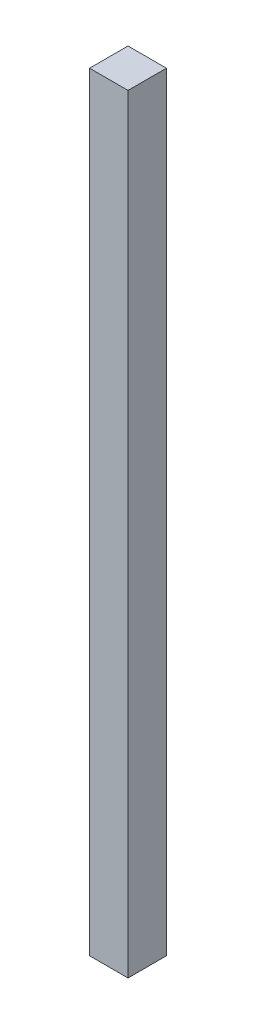
ISO-10303-21;
HEADER;
FILE_DESCRIPTION(('STEP AP214'),'2;1');
FILE_NAME('part.step','',(''),(''),'','','');
FILE_SCHEMA(('AUTOMOTIVE_DESIGN { 1 0 10303 214 1 1 1 1 }'));
ENDSEC;
DATA;
#1=APPLICATION_CONTEXT('core data for automotive mechanical design processes');
#2=APPLICATION_PROTOCOL_DEFINITION('international standard','automotive_design',2000,#1);
#3=PRODUCT_CONTEXT('',#1,'mechanical');
#4=PRODUCT('Part','Part','',(#3));
#5=PRODUCT_RELATED_PRODUCT_CATEGORY('part','',(#4));
#6=PRODUCT_DEFINITION_FORMATION('','',#4);
#7=PRODUCT_DEFINITION_CONTEXT('part definition',#1,'design');
#8=PRODUCT_DEFINITION('design','',#6,#7);
#9=PRODUCT_DEFINITION_SHAPE('','',#8);
#10=(LENGTH_UNIT() NAMED_UNIT(*) SI_UNIT(.MILLI.,.METRE.));
#11=(NAMED_UNIT(*) PLANE_ANGLE_UNIT() SI_UNIT($,.RADIAN.));
#12=(NAMED_UNIT(*) SI_UNIT($,.STERADIAN.) SOLID_ANGLE_UNIT());
#13=UNCERTAINTY_MEASURE_WITH_UNIT(LENGTH_MEASURE(1.E-05),#10,'distance_accuracy_value','');
#14=(GEOMETRIC_REPRESENTATION_CONTEXT(3) GLOBAL_UNCERTAINTY_ASSIGNED_CONTEXT((#13)) GLOBAL_UNIT_ASSIGNED_CONTEXT((#10,
#11,#12)) REPRESENTATION_CONTEXT('',''));
#15=CARTESIAN_POINT('',(0.,0.,0.));
#16=DIRECTION('',(0.,0.,1.));
#17=DIRECTION('',(1.,0.,0.));
#18=AXIS2_PLACEMENT_3D('',#15,#16,#17);
#19=CARTESIAN_POINT('',(10.,400.,-10.));
#20=DIRECTION('',(-1.,0.,0.));
#21=DIRECTION('',(0.,0.,1.));
#22=AXIS2_PLACEMENT_3D('',#19,#20,#21);
#23=PLANE('',#22);
#24=DIRECTION('',(0.,0.,-1.));
#25=VECTOR('',#24,1.);
#26=CARTESIAN_POINT('',(10.,0.,-10.));
#27=LINE('',#26,#25);
#28=CARTESIAN_POINT('',(10.,0.,9.99999999999999));
#29=VERTEX_POINT('',#28);
#30=CARTESIAN_POINT('',(10.,0.,-10.));
#31=VERTEX_POINT('',#30);
#32=EDGE_CURVE('E96',#29,#31,#27,.T.);
#33=ORIENTED_EDGE('',*,*,#32,.T.);
#34=DIRECTION('',(0.,-1.,0.));
#35=VECTOR('',#34,1.);
#36=CARTESIAN_POINT('',(10.,400.,-10.));
#37=LINE('',#36,#35);
#38=CARTESIAN_POINT('',(10.,400.,-10.));
#39=VERTEX_POINT('',#38);
#40=EDGE_CURVE('E11',#39,#31,#37,.T.);
#41=ORIENTED_EDGE('',*,*,#40,.F.);
#42=DIRECTION('',(0.,0.,-1.));
#43=VECTOR('',#42,1.);
#44=CARTESIAN_POINT('',(10.,400.,-10.));
#45=LINE('',#44,#43);
#46=CARTESIAN_POINT('',(10.,400.,9.99999999999999));
#47=VERTEX_POINT('',#46);
#48=EDGE_CURVE('E84',#47,#39,#45,.T.);
#49=ORIENTED_EDGE('',*,*,#48,.F.);
#50=DIRECTION('',(0.,-1.,0.));
#51=VECTOR('',#50,1.);
#52=CARTESIAN_POINT('',(10.,400.,9.99999999999999));
#53=LINE('',#52,#51);
#54=EDGE_CURVE('E92',#47,#29,#53,.T.);
#55=ORIENTED_EDGE('',*,*,#54,.T.);
#56=EDGE_LOOP('',(#33,#41,#49,#55));
#57=FACE_BOUND('',#56,.T.);
#58=ADVANCED_FACE('F33',(#57),#23,.F.);
#59=CARTESIAN_POINT('',(-10.,400.,-10.));
#60=DIRECTION('',(0.,0.,1.));
#61=DIRECTION('',(1.,0.,0.));
#62=AXIS2_PLACEMENT_3D('',#59,#60,#61);
#63=PLANE('',#62);
#64=DIRECTION('',(-1.,0.,0.));
#65=VECTOR('',#64,1.);
#66=CARTESIAN_POINT('',(-10.,0.,-10.));
#67=LINE('',#66,#65);
#68=CARTESIAN_POINT('',(-10.,0.,-10.));
#69=VERTEX_POINT('',#68);
#70=EDGE_CURVE('E88',#31,#69,#67,.T.);
#71=ORIENTED_EDGE('',*,*,#70,.T.);
#72=DIRECTION('',(0.,-1.,0.));
#73=VECTOR('',#72,1.);
#74=CARTESIAN_POINT('',(-10.,400.,-10.));
#75=LINE('',#74,#73);
#76=CARTESIAN_POINT('',(-10.,400.,-10.));
#77=VERTEX_POINT('',#76);
#78=EDGE_CURVE('E41',#77,#69,#75,.T.);
#79=ORIENTED_EDGE('',*,*,#78,.F.);
#80=DIRECTION('',(-1.,0.,0.));
#81=VECTOR('',#80,1.);
#82=CARTESIAN_POINT('',(-10.,400.,-10.));
#83=LINE('',#82,#81);
#84=EDGE_CURVE('E79',#39,#77,#83,.T.);
#85=ORIENTED_EDGE('',*,*,#84,.F.);
#86=ORIENTED_EDGE('',*,*,#40,.T.);
#87=EDGE_LOOP('',(#71,#79,#85,#86));
#88=FACE_BOUND('',#87,.T.);
#89=ADVANCED_FACE('F87',(#88),#63,.F.);
#90=CARTESIAN_POINT('',(-10.,400.,-10.));
#91=DIRECTION('',(1.,0.,0.));
#92=DIRECTION('',(0.,0.,-1.));
#93=AXIS2_PLACEMENT_3D('',#90,#91,#92);
#94=PLANE('',#93);
#95=DIRECTION('',(0.,0.,1.));
#96=VECTOR('',#95,1.);
#97=CARTESIAN_POINT('',(-10.,0.,-10.));
#98=LINE('',#97,#96);
#99=CARTESIAN_POINT('',(-10.,0.,9.99999999999999));
#100=VERTEX_POINT('',#99);
#101=EDGE_CURVE('E66',#69,#100,#98,.T.);
#102=ORIENTED_EDGE('',*,*,#101,.T.);
#103=DIRECTION('',(0.,-1.,0.));
#104=VECTOR('',#103,1.);
#105=CARTESIAN_POINT('',(-10.,400.,9.99999999999999));
#106=LINE('',#105,#104);
#107=CARTESIAN_POINT('',(-10.,400.,9.99999999999999));
#108=VERTEX_POINT('',#107);
#109=EDGE_CURVE('E89',#108,#100,#106,.T.);
#110=ORIENTED_EDGE('',*,*,#109,.F.);
#111=DIRECTION('',(0.,0.,1.));
#112=VECTOR('',#111,1.);
#113=CARTESIAN_POINT('',(-10.,400.,-10.));
#114=LINE('',#113,#112);
#115=EDGE_CURVE('E82',#77,#108,#114,.T.);
#116=ORIENTED_EDGE('',*,*,#115,.F.);
#117=ORIENTED_EDGE('',*,*,#78,.T.);
#118=EDGE_LOOP('',(#102,#110,#116,#117));
#119=FACE_BOUND('',#118,.T.);
#120=ADVANCED_FACE('F90',(#119),#94,.F.);
#121=CARTESIAN_POINT('',(-10.,400.,9.99999999999999));
#122=DIRECTION('',(0.,0.,-1.));
#123=DIRECTION('',(-1.,0.,0.));
#124=AXIS2_PLACEMENT_3D('',#121,#122,#123);
#125=PLANE('',#124);
#126=DIRECTION('',(1.,0.,0.));
#127=VECTOR('',#126,1.);
#128=CARTESIAN_POINT('',(-10.,0.,9.99999999999999));
#129=LINE('',#128,#127);
#130=EDGE_CURVE('E72',#100,#29,#129,.T.);
#131=ORIENTED_EDGE('',*,*,#130,.T.);
#132=ORIENTED_EDGE('',*,*,#54,.F.);
#133=DIRECTION('',(1.,0.,0.));
#134=VECTOR('',#133,1.);
#135=CARTESIAN_POINT('',(-10.,400.,9.99999999999999));
#136=LINE('',#135,#134);
#137=EDGE_CURVE('E49',#108,#47,#136,.T.);
#138=ORIENTED_EDGE('',*,*,#137,.F.);
#139=ORIENTED_EDGE('',*,*,#109,.T.);
#140=EDGE_LOOP('',(#131,#132,#138,#139));
#141=FACE_BOUND('',#140,.T.);
#142=ADVANCED_FACE('F103',(#141),#125,.F.);
#143=CARTESIAN_POINT('',(0.,400.,0.));
#144=DIRECTION('',(0.,1.,0.));
#145=DIRECTION('',(0.,0.,1.));
#146=AXIS2_PLACEMENT_3D('',#143,#144,#145);
#147=PLANE('',#146);
#148=ORIENTED_EDGE('',*,*,#48,.T.);
#149=ORIENTED_EDGE('',*,*,#84,.T.);
#150=ORIENTED_EDGE('',*,*,#115,.T.);
#151=ORIENTED_EDGE('',*,*,#137,.T.);
#152=EDGE_LOOP('',(#148,#149,#150,#151));
#153=FACE_BOUND('',#152,.T.);
#154=ADVANCED_FACE('F80',(#153),#147,.T.);
#155=CARTESIAN_POINT('',(0.,0.,0.));
#156=DIRECTION('',(0.,1.,0.));
#157=DIRECTION('',(0.,0.,1.));
#158=AXIS2_PLACEMENT_3D('',#155,#156,#157);
#159=PLANE('',#158);
#160=ORIENTED_EDGE('',*,*,#32,.F.);
#161=ORIENTED_EDGE('',*,*,#130,.F.);
#162=ORIENTED_EDGE('',*,*,#101,.F.);
#163=ORIENTED_EDGE('',*,*,#70,.F.);
#164=EDGE_LOOP('',(#160,#161,#162,#163));
#165=FACE_BOUND('',#164,.T.);
#166=ADVANCED_FACE('F106',(#165),#159,.F.);
#167=CLOSED_SHELL('',(#58,#89,#120,#142,#154,#166));
#168=MANIFOLD_SOLID_BREP('B2',#167);
#169=ADVANCED_BREP_SHAPE_REPRESENTATION('',(#18,#168),#14);
#170=SHAPE_DEFINITION_REPRESENTATION(#9,#169);
ENDSEC;
END-ISO-10303-21;
